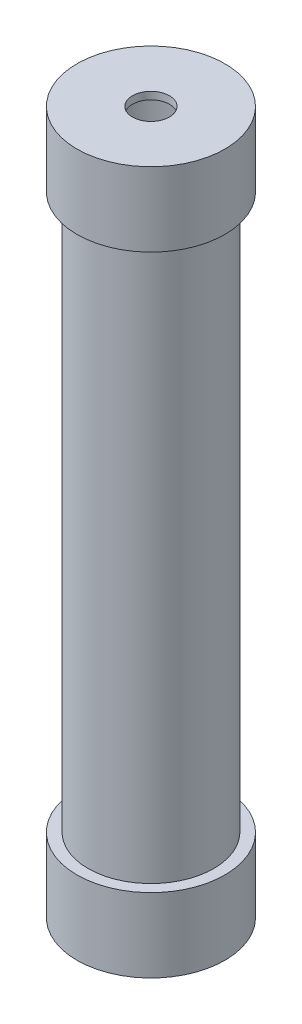
ISO-10303-21;
HEADER;
FILE_DESCRIPTION(('STEP AP214'),'2;1');
FILE_NAME('part.step','',(''),(''),'','','');
FILE_SCHEMA(('AUTOMOTIVE_DESIGN { 1 0 10303 214 1 1 1 1 }'));
ENDSEC;
DATA;
#1=APPLICATION_CONTEXT('core data for automotive mechanical design processes');
#2=APPLICATION_PROTOCOL_DEFINITION('international standard','automotive_design',2000,#1);
#3=PRODUCT_CONTEXT('',#1,'mechanical');
#4=PRODUCT('Part','Part','',(#3));
#5=PRODUCT_RELATED_PRODUCT_CATEGORY('part','',(#4));
#6=PRODUCT_DEFINITION_FORMATION('','',#4);
#7=PRODUCT_DEFINITION_CONTEXT('part definition',#1,'design');
#8=PRODUCT_DEFINITION('design','',#6,#7);
#9=PRODUCT_DEFINITION_SHAPE('','',#8);
#10=(LENGTH_UNIT() NAMED_UNIT(*) SI_UNIT(.MILLI.,.METRE.));
#11=(NAMED_UNIT(*) PLANE_ANGLE_UNIT() SI_UNIT($,.RADIAN.));
#12=(NAMED_UNIT(*) SI_UNIT($,.STERADIAN.) SOLID_ANGLE_UNIT());
#13=UNCERTAINTY_MEASURE_WITH_UNIT(LENGTH_MEASURE(1.E-05),#10,'distance_accuracy_value','');
#14=(GEOMETRIC_REPRESENTATION_CONTEXT(3) GLOBAL_UNCERTAINTY_ASSIGNED_CONTEXT((#13)) GLOBAL_UNIT_ASSIGNED_CONTEXT((#10,
#11,#12)) REPRESENTATION_CONTEXT('',''));
#15=CARTESIAN_POINT('',(0.,0.,0.));
#16=DIRECTION('',(0.,0.,1.));
#17=DIRECTION('',(1.,0.,0.));
#18=AXIS2_PLACEMENT_3D('',#15,#16,#17);
#19=CARTESIAN_POINT('',(0.,0.,0.));
#20=DIRECTION('',(0.,1.,0.));
#21=DIRECTION('',(0.,0.,1.));
#22=AXIS2_PLACEMENT_3D('',#19,#20,#21);
#23=PLANE('',#22);
#24=CARTESIAN_POINT('',(0.,0.,0.));
#25=DIRECTION('',(0.,1.,0.));
#26=DIRECTION('',(0.,0.,1.));
#27=AXIS2_PLACEMENT_3D('',#24,#25,#26);
#28=CIRCLE('',#27,20.);
#29=CARTESIAN_POINT('',(0.,0.,20.));
#30=VERTEX_POINT('',#29);
#31=EDGE_CURVE('E41',#30,#30,#28,.T.);
#32=ORIENTED_EDGE('',*,*,#31,.F.);
#33=EDGE_LOOP('',(#32));
#34=FACE_BOUND('',#33,.T.);
#35=CARTESIAN_POINT('',(0.,0.,0.));
#36=DIRECTION('',(0.,1.,0.));
#37=DIRECTION('',(0.,0.,1.));
#38=AXIS2_PLACEMENT_3D('',#35,#36,#37);
#39=CIRCLE('',#38,17.);
#40=CARTESIAN_POINT('',(0.,0.,17.));
#41=VERTEX_POINT('',#40);
#42=EDGE_CURVE('E64',#41,#41,#39,.T.);
#43=ORIENTED_EDGE('',*,*,#42,.T.);
#44=EDGE_LOOP('',(#43));
#45=FACE_BOUND('',#44,.T.);
#46=ADVANCED_FACE('F37',(#34,#45),#23,.F.);
#47=CARTESIAN_POINT('',(0.,20.,0.));
#48=DIRECTION('',(0.,-1.,0.));
#49=DIRECTION('',(0.,0.,-1.));
#50=AXIS2_PLACEMENT_3D('',#47,#48,#49);
#51=CYLINDRICAL_SURFACE('',#50,15.);
#52=CARTESIAN_POINT('',(0.,-170.,0.));
#53=DIRECTION('',(0.,1.,0.));
#54=DIRECTION('',(0.,0.,1.));
#55=AXIS2_PLACEMENT_3D('',#52,#53,#54);
#56=CIRCLE('',#55,15.);
#57=CARTESIAN_POINT('',(0.,-170.,15.));
#58=VERTEX_POINT('',#57);
#59=EDGE_CURVE('E68',#58,#58,#56,.T.);
#60=ORIENTED_EDGE('',*,*,#59,.F.);
#61=EDGE_LOOP('',(#60));
#62=FACE_BOUND('',#61,.T.);
#63=CARTESIAN_POINT('',(0.,18.,0.));
#64=DIRECTION('',(0.,1.,0.));
#65=DIRECTION('',(0.,0.,1.));
#66=AXIS2_PLACEMENT_3D('',#63,#64,#65);
#67=CIRCLE('',#66,15.);
#68=CARTESIAN_POINT('',(0.,18.,15.));
#69=VERTEX_POINT('',#68);
#70=EDGE_CURVE('E50',#69,#69,#67,.F.);
#71=ORIENTED_EDGE('',*,*,#70,.F.);
#72=EDGE_LOOP('',(#71));
#73=FACE_BOUND('',#72,.T.);
#74=ADVANCED_FACE('F39',(#62,#73),#51,.F.);
#75=CARTESIAN_POINT('',(0.,20.,0.));
#76=DIRECTION('',(0.,-1.,0.));
#77=DIRECTION('',(0.,0.,-1.));
#78=AXIS2_PLACEMENT_3D('',#75,#76,#77);
#79=CYLINDRICAL_SURFACE('',#78,20.);
#80=CARTESIAN_POINT('',(0.,20.,0.));
#81=DIRECTION('',(0.,1.,0.));
#82=DIRECTION('',(0.,0.,1.));
#83=AXIS2_PLACEMENT_3D('',#80,#81,#82);
#84=CIRCLE('',#83,20.);
#85=CARTESIAN_POINT('',(0.,20.,20.));
#86=VERTEX_POINT('',#85);
#87=EDGE_CURVE('E10',#86,#86,#84,.T.);
#88=ORIENTED_EDGE('',*,*,#87,.F.);
#89=EDGE_LOOP('',(#88));
#90=FACE_BOUND('',#89,.T.);
#91=ORIENTED_EDGE('',*,*,#31,.T.);
#92=EDGE_LOOP('',(#91));
#93=FACE_BOUND('',#92,.T.);
#94=ADVANCED_FACE('F108',(#90,#93),#79,.T.);
#95=CARTESIAN_POINT('',(0.,20.,0.));
#96=DIRECTION('',(0.,1.,0.));
#97=DIRECTION('',(0.,0.,1.));
#98=AXIS2_PLACEMENT_3D('',#95,#96,#97);
#99=PLANE('',#98);
#100=ORIENTED_EDGE('',*,*,#87,.T.);
#101=EDGE_LOOP('',(#100));
#102=FACE_BOUND('',#101,.T.);
#103=CARTESIAN_POINT('',(0.,20.,0.));
#104=DIRECTION('',(0.,-1.,0.));
#105=DIRECTION('',(0.,0.,1.));
#106=AXIS2_PLACEMENT_3D('',#103,#104,#105);
#107=CIRCLE('',#106,5.);
#108=CARTESIAN_POINT('',(0.,20.,5.));
#109=VERTEX_POINT('',#108);
#110=EDGE_CURVE('E56',#109,#109,#107,.T.);
#111=ORIENTED_EDGE('',*,*,#110,.T.);
#112=EDGE_LOOP('',(#111));
#113=FACE_BOUND('',#112,.T.);
#114=ADVANCED_FACE('F113',(#102,#113),#99,.T.);
#115=CARTESIAN_POINT('',(0.,18.,0.));
#116=DIRECTION('',(0.,1.,0.));
#117=DIRECTION('',(0.,0.,1.));
#118=AXIS2_PLACEMENT_3D('',#115,#116,#117);
#119=PLANE('',#118);
#120=ORIENTED_EDGE('',*,*,#70,.T.);
#121=EDGE_LOOP('',(#120));
#122=FACE_BOUND('',#121,.T.);
#123=CARTESIAN_POINT('',(0.,18.,0.));
#124=DIRECTION('',(0.,-1.,0.));
#125=DIRECTION('',(0.,0.,1.));
#126=AXIS2_PLACEMENT_3D('',#123,#124,#125);
#127=CIRCLE('',#126,5.);
#128=CARTESIAN_POINT('',(0.,18.,5.));
#129=VERTEX_POINT('',#128);
#130=EDGE_CURVE('E55',#129,#129,#127,.T.);
#131=ORIENTED_EDGE('',*,*,#130,.F.);
#132=EDGE_LOOP('',(#131));
#133=FACE_BOUND('',#132,.T.);
#134=ADVANCED_FACE('F120',(#122,#133),#119,.F.);
#135=CARTESIAN_POINT('',(0.,18.,0.));
#136=DIRECTION('',(0.,1.,0.));
#137=DIRECTION('',(0.,0.,1.));
#138=AXIS2_PLACEMENT_3D('',#135,#136,#137);
#139=CYLINDRICAL_SURFACE('',#138,5.);
#140=ORIENTED_EDGE('',*,*,#110,.F.);
#141=EDGE_LOOP('',(#140));
#142=FACE_BOUND('',#141,.T.);
#143=ORIENTED_EDGE('',*,*,#130,.T.);
#144=EDGE_LOOP('',(#143));
#145=FACE_BOUND('',#144,.T.);
#146=ADVANCED_FACE('F98',(#142,#145),#139,.F.);
#147=CARTESIAN_POINT('',(0.,-150.,0.));
#148=DIRECTION('',(0.,1.,0.));
#149=DIRECTION('',(0.,0.,1.));
#150=AXIS2_PLACEMENT_3D('',#147,#148,#149);
#151=CYLINDRICAL_SURFACE('',#150,17.);
#152=ORIENTED_EDGE('',*,*,#42,.F.);
#153=EDGE_LOOP('',(#152));
#154=FACE_BOUND('',#153,.T.);
#155=CARTESIAN_POINT('',(0.,-150.,0.));
#156=DIRECTION('',(0.,1.,0.));
#157=DIRECTION('',(0.,0.,1.));
#158=AXIS2_PLACEMENT_3D('',#155,#156,#157);
#159=CIRCLE('',#158,17.);
#160=CARTESIAN_POINT('',(0.,-150.,17.));
#161=VERTEX_POINT('',#160);
#162=EDGE_CURVE('E60',#161,#161,#159,.T.);
#163=ORIENTED_EDGE('',*,*,#162,.T.);
#164=EDGE_LOOP('',(#163));
#165=FACE_BOUND('',#164,.T.);
#166=ADVANCED_FACE('F89',(#154,#165),#151,.T.);
#167=CARTESIAN_POINT('',(0.,-170.,0.));
#168=DIRECTION('',(0.,1.,0.));
#169=DIRECTION('',(0.,0.,1.));
#170=AXIS2_PLACEMENT_3D('',#167,#168,#169);
#171=CYLINDRICAL_SURFACE('',#170,20.);
#172=CARTESIAN_POINT('',(0.,-150.,0.));
#173=DIRECTION('',(0.,-1.,0.));
#174=DIRECTION('',(0.,0.,1.));
#175=AXIS2_PLACEMENT_3D('',#172,#173,#174);
#176=CIRCLE('',#175,20.);
#177=CARTESIAN_POINT('',(0.,-150.,20.));
#178=VERTEX_POINT('',#177);
#179=EDGE_CURVE('E72',#178,#178,#176,.T.);
#180=ORIENTED_EDGE('',*,*,#179,.T.);
#181=EDGE_LOOP('',(#180));
#182=FACE_BOUND('',#181,.T.);
#183=CARTESIAN_POINT('',(0.,-170.,0.));
#184=DIRECTION('',(0.,-1.,0.));
#185=DIRECTION('',(0.,0.,1.));
#186=AXIS2_PLACEMENT_3D('',#183,#184,#185);
#187=CIRCLE('',#186,20.);
#188=CARTESIAN_POINT('',(0.,-170.,20.));
#189=VERTEX_POINT('',#188);
#190=EDGE_CURVE('E76',#189,#189,#187,.T.);
#191=ORIENTED_EDGE('',*,*,#190,.F.);
#192=EDGE_LOOP('',(#191));
#193=FACE_BOUND('',#192,.T.);
#194=ADVANCED_FACE('F87',(#182,#193),#171,.T.);
#195=CARTESIAN_POINT('',(0.,-170.,0.));
#196=DIRECTION('',(0.,1.,0.));
#197=DIRECTION('',(0.,0.,1.));
#198=AXIS2_PLACEMENT_3D('',#195,#196,#197);
#199=PLANE('',#198);
#200=ORIENTED_EDGE('',*,*,#190,.T.);
#201=EDGE_LOOP('',(#200));
#202=FACE_BOUND('',#201,.T.);
#203=ORIENTED_EDGE('',*,*,#59,.T.);
#204=EDGE_LOOP('',(#203));
#205=FACE_BOUND('',#204,.T.);
#206=ADVANCED_FACE('F84',(#202,#205),#199,.F.);
#207=CARTESIAN_POINT('',(0.,-150.,0.));
#208=DIRECTION('',(0.,1.,0.));
#209=DIRECTION('',(0.,0.,1.));
#210=AXIS2_PLACEMENT_3D('',#207,#208,#209);
#211=PLANE('',#210);
#212=ORIENTED_EDGE('',*,*,#179,.F.);
#213=EDGE_LOOP('',(#212));
#214=FACE_BOUND('',#213,.T.);
#215=ORIENTED_EDGE('',*,*,#162,.F.);
#216=EDGE_LOOP('',(#215));
#217=FACE_BOUND('',#216,.T.);
#218=ADVANCED_FACE('F96',(#214,#217),#211,.T.);
#219=CLOSED_SHELL('',(#46,#74,#94,#114,#134,#146,#166,#194,#206,#218));
#220=MANIFOLD_SOLID_BREP('B2',#219);
#221=ADVANCED_BREP_SHAPE_REPRESENTATION('',(#18,#220),#14);
#222=SHAPE_DEFINITION_REPRESENTATION(#9,#221);
ENDSEC;
END-ISO-10303-21;
